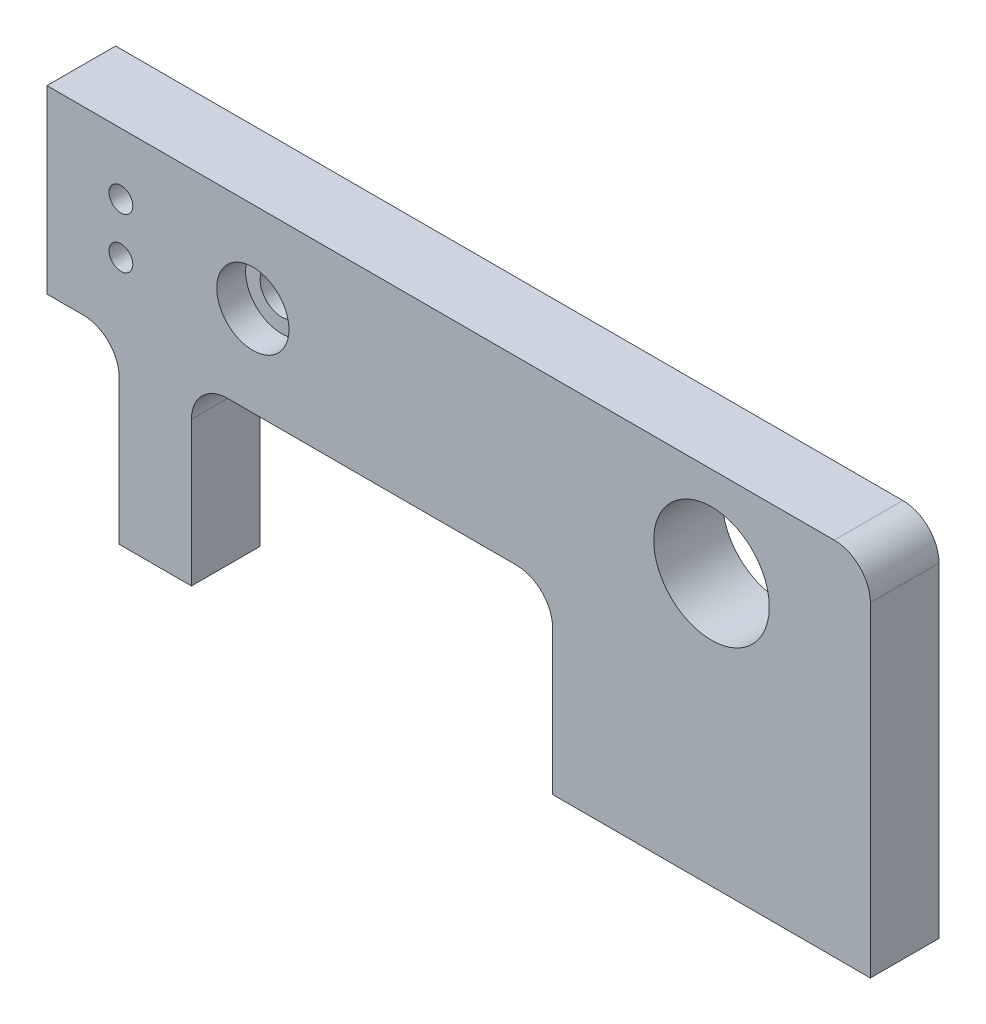
ISO-10303-21;
HEADER;
FILE_DESCRIPTION(('STEP AP214'),'2;1');
FILE_NAME('part.step','',(''),(''),'','','');
FILE_SCHEMA(('AUTOMOTIVE_DESIGN { 1 0 10303 214 1 1 1 1 }'));
ENDSEC;
DATA;
#1=APPLICATION_CONTEXT('core data for automotive mechanical design processes');
#2=APPLICATION_PROTOCOL_DEFINITION('international standard','automotive_design',2000,#1);
#3=PRODUCT_CONTEXT('',#1,'mechanical');
#4=PRODUCT('Part','Part','',(#3));
#5=PRODUCT_RELATED_PRODUCT_CATEGORY('part','',(#4));
#6=PRODUCT_DEFINITION_FORMATION('','',#4);
#7=PRODUCT_DEFINITION_CONTEXT('part definition',#1,'design');
#8=PRODUCT_DEFINITION('design','',#6,#7);
#9=PRODUCT_DEFINITION_SHAPE('','',#8);
#10=(LENGTH_UNIT() NAMED_UNIT(*) SI_UNIT(.MILLI.,.METRE.));
#11=(NAMED_UNIT(*) PLANE_ANGLE_UNIT() SI_UNIT($,.RADIAN.));
#12=(NAMED_UNIT(*) SI_UNIT($,.STERADIAN.) SOLID_ANGLE_UNIT());
#13=UNCERTAINTY_MEASURE_WITH_UNIT(LENGTH_MEASURE(1.E-05),#10,'distance_accuracy_value','');
#14=(GEOMETRIC_REPRESENTATION_CONTEXT(3) GLOBAL_UNCERTAINTY_ASSIGNED_CONTEXT((#13)) GLOBAL_UNIT_ASSIGNED_CONTEXT((#10,
#11,#12)) REPRESENTATION_CONTEXT('',''));
#15=CARTESIAN_POINT('',(0.,0.,0.));
#16=DIRECTION('',(0.,0.,1.));
#17=DIRECTION('',(1.,0.,0.));
#18=AXIS2_PLACEMENT_3D('',#15,#16,#17);
#19=CARTESIAN_POINT('',(-57.,-25.,4.75));
#20=DIRECTION('',(1.,0.,0.));
#21=DIRECTION('',(0.,0.,-1.));
#22=AXIS2_PLACEMENT_3D('',#19,#20,#21);
#23=PLANE('',#22);
#24=DIRECTION('',(0.,0.,1.));
#25=VECTOR('',#24,1.);
#26=CARTESIAN_POINT('',(-57.,0.,-4.75));
#27=LINE('',#26,#25);
#28=CARTESIAN_POINT('',(-57.,0.,-4.75));
#29=VERTEX_POINT('',#28);
#30=CARTESIAN_POINT('',(-57.,0.,4.75));
#31=VERTEX_POINT('',#30);
#32=EDGE_CURVE('E230',#29,#31,#27,.T.);
#33=ORIENTED_EDGE('',*,*,#32,.T.);
#34=DIRECTION('',(0.,-1.,0.));
#35=VECTOR('',#34,1.);
#36=CARTESIAN_POINT('',(-57.,-25.,4.75));
#37=LINE('',#36,#35);
#38=CARTESIAN_POINT('',(-57.,25.,4.75));
#39=VERTEX_POINT('',#38);
#40=EDGE_CURVE('E283',#39,#31,#37,.T.);
#41=ORIENTED_EDGE('',*,*,#40,.F.);
#42=DIRECTION('',(0.,0.,-1.));
#43=VECTOR('',#42,1.);
#44=CARTESIAN_POINT('',(-57.,25.,4.75));
#45=LINE('',#44,#43);
#46=CARTESIAN_POINT('',(-57.,25.,-4.75));
#47=VERTEX_POINT('',#46);
#48=EDGE_CURVE('E300',#39,#47,#45,.T.);
#49=ORIENTED_EDGE('',*,*,#48,.T.);
#50=DIRECTION('',(0.,-1.,0.));
#51=VECTOR('',#50,1.);
#52=CARTESIAN_POINT('',(-57.,-25.,-4.75));
#53=LINE('',#52,#51);
#54=EDGE_CURVE('E292',#47,#29,#53,.T.);
#55=ORIENTED_EDGE('',*,*,#54,.T.);
#56=EDGE_LOOP('',(#33,#41,#49,#55));
#57=FACE_BOUND('',#56,.T.);
#58=ADVANCED_FACE('F47',(#57),#23,.F.);
#59=CARTESIAN_POINT('',(-57.,-25.,4.75));
#60=DIRECTION('',(0.,1.,0.));
#61=DIRECTION('',(0.,0.,1.));
#62=AXIS2_PLACEMENT_3D('',#59,#60,#61);
#63=PLANE('',#62);
#64=CARTESIAN_POINT('',(-42.,-25.,0.));
#65=DIRECTION('',(0.,-1.,0.));
#66=DIRECTION('',(0.,0.,-1.));
#67=AXIS2_PLACEMENT_3D('',#64,#65,#66);
#68=CIRCLE('',#67,1.64999999999999);
#69=CARTESIAN_POINT('',(-42.,-25.,-1.64999999999999));
#70=VERTEX_POINT('',#69);
#71=EDGE_CURVE('E166',#70,#70,#68,.T.);
#72=ORIENTED_EDGE('',*,*,#71,.F.);
#73=EDGE_LOOP('',(#72));
#74=FACE_BOUND('',#73,.T.);
#75=DIRECTION('',(1.,0.,0.));
#76=VECTOR('',#75,1.);
#77=CARTESIAN_POINT('',(-57.,-25.,4.75));
#78=LINE('',#77,#76);
#79=CARTESIAN_POINT('',(-47.,-25.,4.75));
#80=VERTEX_POINT('',#79);
#81=CARTESIAN_POINT('',(-37.,-25.,4.75));
#82=VERTEX_POINT('',#81);
#83=EDGE_CURVE('E288',#80,#82,#78,.T.);
#84=ORIENTED_EDGE('',*,*,#83,.F.);
#85=DIRECTION('',(0.,0.,1.));
#86=VECTOR('',#85,1.);
#87=CARTESIAN_POINT('',(-47.,-25.,-4.75));
#88=LINE('',#87,#86);
#89=CARTESIAN_POINT('',(-47.,-25.,-4.75));
#90=VERTEX_POINT('',#89);
#91=EDGE_CURVE('E228',#90,#80,#88,.T.);
#92=ORIENTED_EDGE('',*,*,#91,.F.);
#93=DIRECTION('',(1.,0.,0.));
#94=VECTOR('',#93,1.);
#95=CARTESIAN_POINT('',(-57.,-25.,-4.75));
#96=LINE('',#95,#94);
#97=CARTESIAN_POINT('',(-37.,-25.,-4.75));
#98=VERTEX_POINT('',#97);
#99=EDGE_CURVE('E281',#90,#98,#96,.T.);
#100=ORIENTED_EDGE('',*,*,#99,.T.);
#101=DIRECTION('',(0.,0.,1.));
#102=VECTOR('',#101,1.);
#103=CARTESIAN_POINT('',(-37.,-25.,-4.75));
#104=LINE('',#103,#102);
#105=EDGE_CURVE('E270',#98,#82,#104,.T.);
#106=ORIENTED_EDGE('',*,*,#105,.T.);
#107=EDGE_LOOP('',(#84,#92,#100,#106));
#108=FACE_BOUND('',#107,.T.);
#109=ADVANCED_FACE('F335',(#74,#108),#63,.F.);
#110=CARTESIAN_POINT('',(57.,-25.,4.75));
#111=DIRECTION('',(-1.,0.,0.));
#112=DIRECTION('',(0.,0.,1.));
#113=AXIS2_PLACEMENT_3D('',#110,#111,#112);
#114=PLANE('',#113);
#115=DIRECTION('',(0.,1.,0.));
#116=VECTOR('',#115,1.);
#117=CARTESIAN_POINT('',(57.,-25.,-4.75));
#118=LINE('',#117,#116);
#119=CARTESIAN_POINT('',(57.,-25.,-4.75));
#120=VERTEX_POINT('',#119);
#121=CARTESIAN_POINT('',(57.,20.,-4.75));
#122=VERTEX_POINT('',#121);
#123=EDGE_CURVE('E267',#120,#122,#118,.T.);
#124=ORIENTED_EDGE('',*,*,#123,.T.);
#125=DIRECTION('',(0.,0.,-1.));
#126=VECTOR('',#125,1.);
#127=CARTESIAN_POINT('',(57.,20.,4.75));
#128=LINE('',#127,#126);
#129=CARTESIAN_POINT('',(57.,20.,4.75));
#130=VERTEX_POINT('',#129);
#131=EDGE_CURVE('E55',#122,#130,#128,.F.);
#132=ORIENTED_EDGE('',*,*,#131,.T.);
#133=DIRECTION('',(0.,1.,0.));
#134=VECTOR('',#133,1.);
#135=CARTESIAN_POINT('',(57.,-25.,4.75));
#136=LINE('',#135,#134);
#137=CARTESIAN_POINT('',(57.,-25.,4.75));
#138=VERTEX_POINT('',#137);
#139=EDGE_CURVE('E278',#138,#130,#136,.T.);
#140=ORIENTED_EDGE('',*,*,#139,.F.);
#141=DIRECTION('',(0.,0.,-1.));
#142=VECTOR('',#141,1.);
#143=CARTESIAN_POINT('',(57.,-25.,4.75));
#144=LINE('',#143,#142);
#145=EDGE_CURVE('E297',#138,#120,#144,.T.);
#146=ORIENTED_EDGE('',*,*,#145,.T.);
#147=EDGE_LOOP('',(#124,#132,#140,#146));
#148=FACE_BOUND('',#147,.T.);
#149=ADVANCED_FACE('F340',(#148),#114,.F.);
#150=CARTESIAN_POINT('',(-57.,25.,4.75));
#151=DIRECTION('',(0.,-1.,0.));
#152=DIRECTION('',(0.,0.,-1.));
#153=AXIS2_PLACEMENT_3D('',#150,#151,#152);
#154=PLANE('',#153);
#155=DIRECTION('',(-1.,0.,0.));
#156=VECTOR('',#155,1.);
#157=CARTESIAN_POINT('',(-57.,25.,4.75));
#158=LINE('',#157,#156);
#159=CARTESIAN_POINT('',(52.,25.,4.75));
#160=VERTEX_POINT('',#159);
#161=EDGE_CURVE('E280',#160,#39,#158,.T.);
#162=ORIENTED_EDGE('',*,*,#161,.F.);
#163=DIRECTION('',(0.,0.,-1.));
#164=VECTOR('',#163,1.);
#165=CARTESIAN_POINT('',(52.,25.,4.75));
#166=LINE('',#165,#164);
#167=CARTESIAN_POINT('',(52.,25.,-4.75));
#168=VERTEX_POINT('',#167);
#169=EDGE_CURVE('E303',#160,#168,#166,.T.);
#170=ORIENTED_EDGE('',*,*,#169,.T.);
#171=DIRECTION('',(-1.,0.,0.));
#172=VECTOR('',#171,1.);
#173=CARTESIAN_POINT('',(-57.,25.,-4.75));
#174=LINE('',#173,#172);
#175=EDGE_CURVE('E290',#168,#47,#174,.T.);
#176=ORIENTED_EDGE('',*,*,#175,.T.);
#177=ORIENTED_EDGE('',*,*,#48,.F.);
#178=EDGE_LOOP('',(#162,#170,#176,#177));
#179=FACE_BOUND('',#178,.T.);
#180=ADVANCED_FACE('F309',(#179),#154,.F.);
#181=CARTESIAN_POINT('',(21.,-25.,0.));
#182=DIRECTION('',(0.,-1.,0.));
#183=DIRECTION('',(0.,0.,-1.));
#184=AXIS2_PLACEMENT_3D('',#181,#182,#183);
#185=CIRCLE('',#184,1.64999999999999);
#186=CARTESIAN_POINT('',(21.,-25.,-1.64999999999999));
#187=VERTEX_POINT('',#186);
#188=EDGE_CURVE('E165',#187,#187,#185,.T.);
#189=ORIENTED_EDGE('',*,*,#188,.F.);
#190=EDGE_LOOP('',(#189));
#191=FACE_BOUND('',#190,.T.);
#192=CARTESIAN_POINT('',(49.,-25.,0.));
#193=DIRECTION('',(0.,-1.,0.));
#194=DIRECTION('',(0.,0.,-1.));
#195=AXIS2_PLACEMENT_3D('',#192,#193,#194);
#196=CIRCLE('',#195,1.64999999999999);
#197=CARTESIAN_POINT('',(49.,-25.,-1.64999999999999));
#198=VERTEX_POINT('',#197);
#199=EDGE_CURVE('E176',#198,#198,#196,.T.);
#200=ORIENTED_EDGE('',*,*,#199,.F.);
#201=EDGE_LOOP('',(#200));
#202=FACE_BOUND('',#201,.T.);
#203=CARTESIAN_POINT('',(13.,-25.,4.75));
#204=VERTEX_POINT('',#203);
#205=EDGE_CURVE('E286',#204,#138,#78,.T.);
#206=ORIENTED_EDGE('',*,*,#205,.F.);
#207=DIRECTION('',(0.,0.,1.));
#208=VECTOR('',#207,1.);
#209=CARTESIAN_POINT('',(13.,-25.,-4.75));
#210=LINE('',#209,#208);
#211=CARTESIAN_POINT('',(13.,-25.,-4.75));
#212=VERTEX_POINT('',#211);
#213=EDGE_CURVE('E268',#212,#204,#210,.T.);
#214=ORIENTED_EDGE('',*,*,#213,.F.);
#215=EDGE_CURVE('E295',#212,#120,#96,.T.);
#216=ORIENTED_EDGE('',*,*,#215,.T.);
#217=ORIENTED_EDGE('',*,*,#145,.F.);
#218=EDGE_LOOP('',(#206,#214,#216,#217));
#219=FACE_BOUND('',#218,.T.);
#220=ADVANCED_FACE('F343',(#191,#202,#219),#63,.F.);
#221=CARTESIAN_POINT('',(0.,0.,4.75));
#222=DIRECTION('',(0.,0.,-1.));
#223=DIRECTION('',(-1.,0.,0.));
#224=AXIS2_PLACEMENT_3D('',#221,#222,#223);
#225=PLANE('',#224);
#226=CARTESIAN_POINT('',(-46.77,9.5,4.75));
#227=DIRECTION('',(0.,0.,1.));
#228=DIRECTION('',(1.,0.,0.));
#229=AXIS2_PLACEMENT_3D('',#226,#227,#228);
#230=CIRCLE('',#229,1.65);
#231=CARTESIAN_POINT('',(-45.12,9.5,4.75));
#232=VERTEX_POINT('',#231);
#233=EDGE_CURVE('E182',#232,#232,#230,.T.);
#234=ORIENTED_EDGE('',*,*,#233,.F.);
#235=EDGE_LOOP('',(#234));
#236=FACE_BOUND('',#235,.T.);
#237=CARTESIAN_POINT('',(-46.77,16.5,4.75));
#238=DIRECTION('',(0.,0.,1.));
#239=DIRECTION('',(1.,0.,0.));
#240=AXIS2_PLACEMENT_3D('',#237,#238,#239);
#241=CIRCLE('',#240,1.65);
#242=CARTESIAN_POINT('',(-45.12,16.5,4.75));
#243=VERTEX_POINT('',#242);
#244=EDGE_CURVE('E188',#243,#243,#241,.T.);
#245=ORIENTED_EDGE('',*,*,#244,.F.);
#246=EDGE_LOOP('',(#245));
#247=FACE_BOUND('',#246,.T.);
#248=CARTESIAN_POINT('',(-28.5,12.5,4.75));
#249=DIRECTION('',(0.,0.,1.));
#250=DIRECTION('',(1.,0.,0.));
#251=AXIS2_PLACEMENT_3D('',#248,#249,#250);
#252=CIRCLE('',#251,5.);
#253=CARTESIAN_POINT('',(-23.5,12.5,4.75));
#254=VERTEX_POINT('',#253);
#255=EDGE_CURVE('E198',#254,#254,#252,.T.);
#256=ORIENTED_EDGE('',*,*,#255,.F.);
#257=EDGE_LOOP('',(#256));
#258=FACE_BOUND('',#257,.T.);
#259=CARTESIAN_POINT('',(35.,12.5,4.75));
#260=DIRECTION('',(0.,0.,1.));
#261=DIRECTION('',(1.,0.,0.));
#262=AXIS2_PLACEMENT_3D('',#259,#260,#261);
#263=CIRCLE('',#262,8.);
#264=CARTESIAN_POINT('',(43.,12.5,4.75));
#265=VERTEX_POINT('',#264);
#266=EDGE_CURVE('E204',#265,#265,#263,.T.);
#267=ORIENTED_EDGE('',*,*,#266,.F.);
#268=EDGE_LOOP('',(#267));
#269=FACE_BOUND('',#268,.T.);
#270=ORIENTED_EDGE('',*,*,#139,.T.);
#271=CARTESIAN_POINT('',(52.,20.,4.75));
#272=DIRECTION('',(0.,0.,-1.));
#273=DIRECTION('',(-1.,0.,0.));
#274=AXIS2_PLACEMENT_3D('',#271,#272,#273);
#275=CIRCLE('',#274,5.);
#276=EDGE_CURVE('E11',#130,#160,#275,.F.);
#277=ORIENTED_EDGE('',*,*,#276,.T.);
#278=ORIENTED_EDGE('',*,*,#161,.T.);
#279=ORIENTED_EDGE('',*,*,#40,.T.);
#280=DIRECTION('',(1.,0.,0.));
#281=VECTOR('',#280,1.);
#282=CARTESIAN_POINT('',(0.,0.,4.75));
#283=LINE('',#282,#281);
#284=CARTESIAN_POINT('',(-52.,0.,4.75));
#285=VERTEX_POINT('',#284);
#286=EDGE_CURVE('E219',#31,#285,#283,.T.);
#287=ORIENTED_EDGE('',*,*,#286,.T.);
#288=CARTESIAN_POINT('',(-52.,-5.,4.75));
#289=DIRECTION('',(0.,0.,1.));
#290=DIRECTION('',(1.,0.,0.));
#291=AXIS2_PLACEMENT_3D('',#288,#289,#290);
#292=CIRCLE('',#291,5.);
#293=CARTESIAN_POINT('',(-47.,-5.00000000000004,4.75));
#294=VERTEX_POINT('',#293);
#295=EDGE_CURVE('E216',#285,#294,#292,.F.);
#296=ORIENTED_EDGE('',*,*,#295,.T.);
#297=DIRECTION('',(0.,1.,0.));
#298=VECTOR('',#297,1.);
#299=CARTESIAN_POINT('',(-47.,0.,4.75));
#300=LINE('',#299,#298);
#301=EDGE_CURVE('E210',#80,#294,#300,.T.);
#302=ORIENTED_EDGE('',*,*,#301,.F.);
#303=ORIENTED_EDGE('',*,*,#83,.T.);
#304=DIRECTION('',(0.,1.,0.));
#305=VECTOR('',#304,1.);
#306=CARTESIAN_POINT('',(-37.,0.,4.75));
#307=LINE('',#306,#305);
#308=CARTESIAN_POINT('',(-37.,-5.00000000000003,4.75));
#309=VERTEX_POINT('',#308);
#310=EDGE_CURVE('E260',#82,#309,#307,.T.);
#311=ORIENTED_EDGE('',*,*,#310,.T.);
#312=CARTESIAN_POINT('',(-32.,-5.,4.75));
#313=DIRECTION('',(0.,0.,1.));
#314=DIRECTION('',(1.,0.,0.));
#315=AXIS2_PLACEMENT_3D('',#312,#313,#314);
#316=CIRCLE('',#315,5.);
#317=CARTESIAN_POINT('',(-32.,0.,4.75));
#318=VERTEX_POINT('',#317);
#319=EDGE_CURVE('E257',#318,#309,#316,.T.);
#320=ORIENTED_EDGE('',*,*,#319,.F.);
#321=DIRECTION('',(1.,0.,0.));
#322=VECTOR('',#321,1.);
#323=CARTESIAN_POINT('',(0.,0.,4.75));
#324=LINE('',#323,#322);
#325=CARTESIAN_POINT('',(7.99999999999998,0.,4.75));
#326=VERTEX_POINT('',#325);
#327=EDGE_CURVE('E254',#318,#326,#324,.T.);
#328=ORIENTED_EDGE('',*,*,#327,.T.);
#329=CARTESIAN_POINT('',(8.00000000000001,-5.,4.75));
#330=DIRECTION('',(0.,0.,1.));
#331=DIRECTION('',(1.,0.,0.));
#332=AXIS2_PLACEMENT_3D('',#329,#330,#331);
#333=CIRCLE('',#332,5.);
#334=CARTESIAN_POINT('',(13.,-5.00000000000003,4.75));
#335=VERTEX_POINT('',#334);
#336=EDGE_CURVE('E227',#326,#335,#333,.F.);
#337=ORIENTED_EDGE('',*,*,#336,.T.);
#338=DIRECTION('',(0.,1.,0.));
#339=VECTOR('',#338,1.);
#340=CARTESIAN_POINT('',(13.,0.,4.75));
#341=LINE('',#340,#339);
#342=EDGE_CURVE('E241',#204,#335,#341,.T.);
#343=ORIENTED_EDGE('',*,*,#342,.F.);
#344=ORIENTED_EDGE('',*,*,#205,.T.);
#345=EDGE_LOOP('',(#270,#277,#278,#279,#287,#296,#302,#303,#311,#320,#328,#337,#343,#344));
#346=FACE_BOUND('',#345,.T.);
#347=ADVANCED_FACE('F320',(#236,#247,#258,#269,#346),#225,.F.);
#348=CARTESIAN_POINT('',(0.,0.,-4.75));
#349=DIRECTION('',(0.,0.,-1.));
#350=DIRECTION('',(-1.,0.,0.));
#351=AXIS2_PLACEMENT_3D('',#348,#349,#350);
#352=PLANE('',#351);
#353=CARTESIAN_POINT('',(-46.77,9.5,-4.75));
#354=DIRECTION('',(0.,0.,1.));
#355=DIRECTION('',(1.,0.,0.));
#356=AXIS2_PLACEMENT_3D('',#353,#354,#355);
#357=CIRCLE('',#356,1.65);
#358=CARTESIAN_POINT('',(-45.12,9.5,-4.75));
#359=VERTEX_POINT('',#358);
#360=EDGE_CURVE('E185',#359,#359,#357,.T.);
#361=ORIENTED_EDGE('',*,*,#360,.T.);
#362=EDGE_LOOP('',(#361));
#363=FACE_BOUND('',#362,.T.);
#364=CARTESIAN_POINT('',(-46.77,16.5,-4.75));
#365=DIRECTION('',(0.,0.,1.));
#366=DIRECTION('',(1.,0.,0.));
#367=AXIS2_PLACEMENT_3D('',#364,#365,#366);
#368=CIRCLE('',#367,1.65);
#369=CARTESIAN_POINT('',(-45.12,16.5,-4.75));
#370=VERTEX_POINT('',#369);
#371=EDGE_CURVE('E191',#370,#370,#368,.T.);
#372=ORIENTED_EDGE('',*,*,#371,.T.);
#373=EDGE_LOOP('',(#372));
#374=FACE_BOUND('',#373,.T.);
#375=CARTESIAN_POINT('',(-28.5,12.5,-4.75));
#376=DIRECTION('',(0.,0.,1.));
#377=DIRECTION('',(1.,0.,0.));
#378=AXIS2_PLACEMENT_3D('',#375,#376,#377);
#379=CIRCLE('',#378,3.);
#380=CARTESIAN_POINT('',(-25.5,12.5,-4.75));
#381=VERTEX_POINT('',#380);
#382=EDGE_CURVE('E195',#381,#381,#379,.T.);
#383=ORIENTED_EDGE('',*,*,#382,.T.);
#384=EDGE_LOOP('',(#383));
#385=FACE_BOUND('',#384,.T.);
#386=CARTESIAN_POINT('',(35.,12.5,-4.75));
#387=DIRECTION('',(0.,0.,1.));
#388=DIRECTION('',(1.,0.,0.));
#389=AXIS2_PLACEMENT_3D('',#386,#387,#388);
#390=CIRCLE('',#389,8.);
#391=CARTESIAN_POINT('',(43.,12.5,-4.75));
#392=VERTEX_POINT('',#391);
#393=EDGE_CURVE('E220',#392,#392,#390,.T.);
#394=ORIENTED_EDGE('',*,*,#393,.T.);
#395=EDGE_LOOP('',(#394));
#396=FACE_BOUND('',#395,.T.);
#397=ORIENTED_EDGE('',*,*,#175,.F.);
#398=CARTESIAN_POINT('',(52.,20.,-4.75));
#399=DIRECTION('',(0.,0.,-1.));
#400=DIRECTION('',(-1.,0.,0.));
#401=AXIS2_PLACEMENT_3D('',#398,#399,#400);
#402=CIRCLE('',#401,5.);
#403=EDGE_CURVE('E69',#168,#122,#402,.T.);
#404=ORIENTED_EDGE('',*,*,#403,.T.);
#405=ORIENTED_EDGE('',*,*,#123,.F.);
#406=ORIENTED_EDGE('',*,*,#215,.F.);
#407=DIRECTION('',(0.,1.,0.));
#408=VECTOR('',#407,1.);
#409=CARTESIAN_POINT('',(13.,0.,-4.75));
#410=LINE('',#409,#408);
#411=CARTESIAN_POINT('',(13.,-5.00000000000003,-4.75));
#412=VERTEX_POINT('',#411);
#413=EDGE_CURVE('E248',#212,#412,#410,.T.);
#414=ORIENTED_EDGE('',*,*,#413,.T.);
#415=CARTESIAN_POINT('',(8.00000000000001,-5.,-4.75));
#416=DIRECTION('',(0.,0.,1.));
#417=DIRECTION('',(1.,0.,0.));
#418=AXIS2_PLACEMENT_3D('',#415,#416,#417);
#419=CIRCLE('',#418,5.);
#420=CARTESIAN_POINT('',(7.99999999999998,0.,-4.75));
#421=VERTEX_POINT('',#420);
#422=EDGE_CURVE('E238',#421,#412,#419,.F.);
#423=ORIENTED_EDGE('',*,*,#422,.F.);
#424=DIRECTION('',(1.,0.,0.));
#425=VECTOR('',#424,1.);
#426=CARTESIAN_POINT('',(0.,0.,-4.75));
#427=LINE('',#426,#425);
#428=CARTESIAN_POINT('',(-32.,0.,-4.75));
#429=VERTEX_POINT('',#428);
#430=EDGE_CURVE('E240',#429,#421,#427,.T.);
#431=ORIENTED_EDGE('',*,*,#430,.F.);
#432=CARTESIAN_POINT('',(-32.,-5.,-4.75));
#433=DIRECTION('',(0.,0.,1.));
#434=DIRECTION('',(1.,0.,0.));
#435=AXIS2_PLACEMENT_3D('',#432,#433,#434);
#436=CIRCLE('',#435,5.);
#437=CARTESIAN_POINT('',(-37.,-5.00000000000003,-4.75));
#438=VERTEX_POINT('',#437);
#439=EDGE_CURVE('E243',#429,#438,#436,.T.);
#440=ORIENTED_EDGE('',*,*,#439,.T.);
#441=DIRECTION('',(0.,1.,0.));
#442=VECTOR('',#441,1.);
#443=CARTESIAN_POINT('',(-37.,0.,-4.75));
#444=LINE('',#443,#442);
#445=EDGE_CURVE('E246',#98,#438,#444,.T.);
#446=ORIENTED_EDGE('',*,*,#445,.F.);
#447=ORIENTED_EDGE('',*,*,#99,.F.);
#448=DIRECTION('',(0.,1.,0.));
#449=VECTOR('',#448,1.);
#450=CARTESIAN_POINT('',(-47.,0.,-4.75));
#451=LINE('',#450,#449);
#452=CARTESIAN_POINT('',(-47.,-5.00000000000004,-4.75));
#453=VERTEX_POINT('',#452);
#454=EDGE_CURVE('E212',#90,#453,#451,.T.);
#455=ORIENTED_EDGE('',*,*,#454,.T.);
#456=CARTESIAN_POINT('',(-52.,-5.,-4.75));
#457=DIRECTION('',(0.,0.,1.));
#458=DIRECTION('',(1.,0.,0.));
#459=AXIS2_PLACEMENT_3D('',#456,#457,#458);
#460=CIRCLE('',#459,5.);
#461=CARTESIAN_POINT('',(-52.,0.,-4.75));
#462=VERTEX_POINT('',#461);
#463=EDGE_CURVE('E207',#462,#453,#460,.F.);
#464=ORIENTED_EDGE('',*,*,#463,.F.);
#465=DIRECTION('',(1.,0.,0.));
#466=VECTOR('',#465,1.);
#467=CARTESIAN_POINT('',(0.,0.,-4.75));
#468=LINE('',#467,#466);
#469=EDGE_CURVE('E209',#29,#462,#468,.T.);
#470=ORIENTED_EDGE('',*,*,#469,.F.);
#471=ORIENTED_EDGE('',*,*,#54,.F.);
#472=EDGE_LOOP('',(#397,#404,#405,#406,#414,#423,#431,#440,#446,#447,#455,#464,#470,#471));
#473=FACE_BOUND('',#472,.T.);
#474=ADVANCED_FACE('F314',(#363,#374,#385,#396,#473),#352,.T.);
#475=CARTESIAN_POINT('',(8.00000000000001,-5.,-4.75));
#476=DIRECTION('',(0.,0.,1.));
#477=DIRECTION('',(1.,0.,0.));
#478=AXIS2_PLACEMENT_3D('',#475,#476,#477);
#479=CYLINDRICAL_SURFACE('',#478,5.);
#480=ORIENTED_EDGE('',*,*,#336,.F.);
#481=DIRECTION('',(0.,0.,1.));
#482=VECTOR('',#481,1.);
#483=CARTESIAN_POINT('',(7.99999999999998,0.,-4.75));
#484=LINE('',#483,#482);
#485=EDGE_CURVE('E251',#421,#326,#484,.T.);
#486=ORIENTED_EDGE('',*,*,#485,.F.);
#487=ORIENTED_EDGE('',*,*,#422,.T.);
#488=DIRECTION('',(0.,0.,1.));
#489=VECTOR('',#488,1.);
#490=CARTESIAN_POINT('',(13.,-5.00000000000003,-4.75));
#491=LINE('',#490,#489);
#492=EDGE_CURVE('E265',#412,#335,#491,.T.);
#493=ORIENTED_EDGE('',*,*,#492,.T.);
#494=EDGE_LOOP('',(#480,#486,#487,#493));
#495=FACE_BOUND('',#494,.T.);
#496=ADVANCED_FACE('F365',(#495),#479,.F.);
#497=CARTESIAN_POINT('',(13.,0.,-4.75));
#498=DIRECTION('',(1.,0.,0.));
#499=DIRECTION('',(0.,0.,-1.));
#500=AXIS2_PLACEMENT_3D('',#497,#498,#499);
#501=PLANE('',#500);
#502=ORIENTED_EDGE('',*,*,#342,.T.);
#503=ORIENTED_EDGE('',*,*,#492,.F.);
#504=ORIENTED_EDGE('',*,*,#413,.F.);
#505=ORIENTED_EDGE('',*,*,#213,.T.);
#506=EDGE_LOOP('',(#502,#503,#504,#505));
#507=FACE_BOUND('',#506,.T.);
#508=ADVANCED_FACE('F358',(#507),#501,.F.);
#509=CARTESIAN_POINT('',(-37.,0.,-4.75));
#510=DIRECTION('',(1.,0.,0.));
#511=DIRECTION('',(0.,0.,-1.));
#512=AXIS2_PLACEMENT_3D('',#509,#510,#511);
#513=PLANE('',#512);
#514=ORIENTED_EDGE('',*,*,#310,.F.);
#515=ORIENTED_EDGE('',*,*,#105,.F.);
#516=ORIENTED_EDGE('',*,*,#445,.T.);
#517=DIRECTION('',(0.,0.,1.));
#518=VECTOR('',#517,1.);
#519=CARTESIAN_POINT('',(-37.,-5.00000000000003,-4.75));
#520=LINE('',#519,#518);
#521=EDGE_CURVE('E273',#438,#309,#520,.T.);
#522=ORIENTED_EDGE('',*,*,#521,.T.);
#523=EDGE_LOOP('',(#514,#515,#516,#522));
#524=FACE_BOUND('',#523,.T.);
#525=ADVANCED_FACE('F375',(#524),#513,.T.);
#526=CARTESIAN_POINT('',(-32.,-5.,-4.75));
#527=DIRECTION('',(0.,0.,1.));
#528=DIRECTION('',(1.,0.,0.));
#529=AXIS2_PLACEMENT_3D('',#526,#527,#528);
#530=CYLINDRICAL_SURFACE('',#529,5.);
#531=ORIENTED_EDGE('',*,*,#319,.T.);
#532=ORIENTED_EDGE('',*,*,#521,.F.);
#533=ORIENTED_EDGE('',*,*,#439,.F.);
#534=DIRECTION('',(0.,0.,1.));
#535=VECTOR('',#534,1.);
#536=CARTESIAN_POINT('',(-32.,0.,-4.75));
#537=LINE('',#536,#535);
#538=EDGE_CURVE('E275',#429,#318,#537,.T.);
#539=ORIENTED_EDGE('',*,*,#538,.T.);
#540=EDGE_LOOP('',(#531,#532,#533,#539));
#541=FACE_BOUND('',#540,.T.);
#542=ADVANCED_FACE('F372',(#541),#530,.F.);
#543=CARTESIAN_POINT('',(0.,0.,-4.75));
#544=DIRECTION('',(0.,-1.,0.));
#545=DIRECTION('',(0.,0.,-1.));
#546=AXIS2_PLACEMENT_3D('',#543,#544,#545);
#547=PLANE('',#546);
#548=ORIENTED_EDGE('',*,*,#327,.F.);
#549=ORIENTED_EDGE('',*,*,#538,.F.);
#550=ORIENTED_EDGE('',*,*,#430,.T.);
#551=ORIENTED_EDGE('',*,*,#485,.T.);
#552=EDGE_LOOP('',(#548,#549,#550,#551));
#553=FACE_BOUND('',#552,.T.);
#554=ADVANCED_FACE('F370',(#553),#547,.T.);
#555=CARTESIAN_POINT('',(-52.,-5.,-4.75));
#556=DIRECTION('',(0.,0.,1.));
#557=DIRECTION('',(1.,0.,0.));
#558=AXIS2_PLACEMENT_3D('',#555,#556,#557);
#559=CYLINDRICAL_SURFACE('',#558,5.);
#560=ORIENTED_EDGE('',*,*,#295,.F.);
#561=DIRECTION('',(0.,0.,1.));
#562=VECTOR('',#561,1.);
#563=CARTESIAN_POINT('',(-52.,0.,-4.75));
#564=LINE('',#563,#562);
#565=EDGE_CURVE('E215',#462,#285,#564,.T.);
#566=ORIENTED_EDGE('',*,*,#565,.F.);
#567=ORIENTED_EDGE('',*,*,#463,.T.);
#568=DIRECTION('',(0.,0.,1.));
#569=VECTOR('',#568,1.);
#570=CARTESIAN_POINT('',(-47.,-5.00000000000004,-4.75));
#571=LINE('',#570,#569);
#572=EDGE_CURVE('E225',#453,#294,#571,.T.);
#573=ORIENTED_EDGE('',*,*,#572,.T.);
#574=EDGE_LOOP('',(#560,#566,#567,#573));
#575=FACE_BOUND('',#574,.T.);
#576=ADVANCED_FACE('F389',(#575),#559,.F.);
#577=CARTESIAN_POINT('',(-47.,0.,-4.75));
#578=DIRECTION('',(1.,0.,0.));
#579=DIRECTION('',(0.,0.,-1.));
#580=AXIS2_PLACEMENT_3D('',#577,#578,#579);
#581=PLANE('',#580);
#582=ORIENTED_EDGE('',*,*,#301,.T.);
#583=ORIENTED_EDGE('',*,*,#572,.F.);
#584=ORIENTED_EDGE('',*,*,#454,.F.);
#585=ORIENTED_EDGE('',*,*,#91,.T.);
#586=EDGE_LOOP('',(#582,#583,#584,#585));
#587=FACE_BOUND('',#586,.T.);
#588=ADVANCED_FACE('F384',(#587),#581,.F.);
#589=CARTESIAN_POINT('',(0.,0.,-4.75));
#590=DIRECTION('',(0.,-1.,0.));
#591=DIRECTION('',(0.,0.,-1.));
#592=AXIS2_PLACEMENT_3D('',#589,#590,#591);
#593=PLANE('',#592);
#594=ORIENTED_EDGE('',*,*,#286,.F.);
#595=ORIENTED_EDGE('',*,*,#32,.F.);
#596=ORIENTED_EDGE('',*,*,#469,.T.);
#597=ORIENTED_EDGE('',*,*,#565,.T.);
#598=EDGE_LOOP('',(#594,#595,#596,#597));
#599=FACE_BOUND('',#598,.T.);
#600=ADVANCED_FACE('F331',(#599),#593,.T.);
#601=CARTESIAN_POINT('',(35.,12.5,-4.75));
#602=DIRECTION('',(0.,0.,1.));
#603=DIRECTION('',(1.,0.,0.));
#604=AXIS2_PLACEMENT_3D('',#601,#602,#603);
#605=CYLINDRICAL_SURFACE('',#604,8.);
#606=ORIENTED_EDGE('',*,*,#393,.F.);
#607=EDGE_LOOP('',(#606));
#608=FACE_BOUND('',#607,.T.);
#609=ORIENTED_EDGE('',*,*,#266,.T.);
#610=EDGE_LOOP('',(#609));
#611=FACE_BOUND('',#610,.T.);
#612=ADVANCED_FACE('F323',(#608,#611),#605,.F.);
#613=CARTESIAN_POINT('',(52.,20.,4.75));
#614=DIRECTION('',(0.,0.,-1.));
#615=DIRECTION('',(-1.,0.,0.));
#616=AXIS2_PLACEMENT_3D('',#613,#614,#615);
#617=CYLINDRICAL_SURFACE('',#616,5.);
#618=ORIENTED_EDGE('',*,*,#276,.F.);
#619=ORIENTED_EDGE('',*,*,#131,.F.);
#620=ORIENTED_EDGE('',*,*,#403,.F.);
#621=ORIENTED_EDGE('',*,*,#169,.F.);
#622=EDGE_LOOP('',(#618,#619,#620,#621));
#623=FACE_BOUND('',#622,.T.);
#624=ADVANCED_FACE('F49',(#623),#617,.T.);
#625=CARTESIAN_POINT('',(-28.5,12.5,0.75));
#626=DIRECTION('',(0.,0.,1.));
#627=DIRECTION('',(1.,0.,0.));
#628=AXIS2_PLACEMENT_3D('',#625,#626,#627);
#629=CYLINDRICAL_SURFACE('',#628,5.);
#630=CARTESIAN_POINT('',(-28.5,12.5,0.75));
#631=DIRECTION('',(0.,0.,1.));
#632=DIRECTION('',(1.,0.,0.));
#633=AXIS2_PLACEMENT_3D('',#630,#631,#632);
#634=CIRCLE('',#633,5.);
#635=CARTESIAN_POINT('',(-23.5,12.5,0.75));
#636=VERTEX_POINT('',#635);
#637=EDGE_CURVE('E201',#636,#636,#634,.T.);
#638=ORIENTED_EDGE('',*,*,#637,.F.);
#639=EDGE_LOOP('',(#638));
#640=FACE_BOUND('',#639,.T.);
#641=ORIENTED_EDGE('',*,*,#255,.T.);
#642=EDGE_LOOP('',(#641));
#643=FACE_BOUND('',#642,.T.);
#644=ADVANCED_FACE('F322',(#640,#643),#629,.F.);
#645=CARTESIAN_POINT('',(-28.5,12.5,0.75));
#646=DIRECTION('',(0.,0.,1.));
#647=DIRECTION('',(1.,0.,0.));
#648=AXIS2_PLACEMENT_3D('',#645,#646,#647);
#649=PLANE('',#648);
#650=CARTESIAN_POINT('',(-28.5,12.5,0.75));
#651=DIRECTION('',(0.,0.,1.));
#652=DIRECTION('',(1.,0.,0.));
#653=AXIS2_PLACEMENT_3D('',#650,#651,#652);
#654=CIRCLE('',#653,3.);
#655=CARTESIAN_POINT('',(-25.5,12.5,0.75));
#656=VERTEX_POINT('',#655);
#657=EDGE_CURVE('E194',#656,#656,#654,.T.);
#658=ORIENTED_EDGE('',*,*,#657,.F.);
#659=EDGE_LOOP('',(#658));
#660=FACE_BOUND('',#659,.T.);
#661=ORIENTED_EDGE('',*,*,#637,.T.);
#662=EDGE_LOOP('',(#661));
#663=FACE_BOUND('',#662,.T.);
#664=ADVANCED_FACE('F328',(#660,#663),#649,.T.);
#665=CARTESIAN_POINT('',(-28.5,12.5,-4.75));
#666=DIRECTION('',(0.,0.,1.));
#667=DIRECTION('',(1.,0.,0.));
#668=AXIS2_PLACEMENT_3D('',#665,#666,#667);
#669=CYLINDRICAL_SURFACE('',#668,3.);
#670=ORIENTED_EDGE('',*,*,#382,.F.);
#671=EDGE_LOOP('',(#670));
#672=FACE_BOUND('',#671,.T.);
#673=ORIENTED_EDGE('',*,*,#657,.T.);
#674=EDGE_LOOP('',(#673));
#675=FACE_BOUND('',#674,.T.);
#676=ADVANCED_FACE('F427',(#672,#675),#669,.F.);
#677=CARTESIAN_POINT('',(-46.77,16.5,4.75));
#678=DIRECTION('',(0.,0.,1.));
#679=DIRECTION('',(1.,0.,0.));
#680=AXIS2_PLACEMENT_3D('',#677,#678,#679);
#681=CYLINDRICAL_SURFACE('',#680,1.65);
#682=ORIENTED_EDGE('',*,*,#371,.F.);
#683=EDGE_LOOP('',(#682));
#684=FACE_BOUND('',#683,.T.);
#685=ORIENTED_EDGE('',*,*,#244,.T.);
#686=EDGE_LOOP('',(#685));
#687=FACE_BOUND('',#686,.T.);
#688=ADVANCED_FACE('F430',(#684,#687),#681,.F.);
#689=CARTESIAN_POINT('',(-46.77,9.5,4.75));
#690=DIRECTION('',(0.,0.,1.));
#691=DIRECTION('',(1.,0.,0.));
#692=AXIS2_PLACEMENT_3D('',#689,#690,#691);
#693=CYLINDRICAL_SURFACE('',#692,1.65);
#694=ORIENTED_EDGE('',*,*,#360,.F.);
#695=EDGE_LOOP('',(#694));
#696=FACE_BOUND('',#695,.T.);
#697=ORIENTED_EDGE('',*,*,#233,.T.);
#698=EDGE_LOOP('',(#697));
#699=FACE_BOUND('',#698,.T.);
#700=ADVANCED_FACE('F446',(#696,#699),#693,.F.);
#701=CARTESIAN_POINT('',(49.,-10.9,0.));
#702=DIRECTION('',(0.,-1.,0.));
#703=DIRECTION('',(0.,0.,-1.));
#704=AXIS2_PLACEMENT_3D('',#701,#702,#703);
#705=CONICAL_SURFACE('',#704,1.65,1.02974425867665);
#706=CARTESIAN_POINT('',(49.,-9.90857997860453,0.));
#707=VERTEX_POINT('',#706);
#708=VERTEX_LOOP('',#707);
#709=FACE_BOUND('',#708,.T.);
#710=CARTESIAN_POINT('',(49.,-10.9,0.));
#711=DIRECTION('',(0.,-1.,0.));
#712=DIRECTION('',(0.,0.,-1.));
#713=AXIS2_PLACEMENT_3D('',#710,#711,#712);
#714=CIRCLE('',#713,1.65);
#715=CARTESIAN_POINT('',(49.,-10.9,-1.65));
#716=VERTEX_POINT('',#715);
#717=EDGE_CURVE('E179',#716,#716,#714,.T.);
#718=ORIENTED_EDGE('',*,*,#717,.T.);
#719=EDGE_LOOP('',(#718));
#720=FACE_BOUND('',#719,.T.);
#721=ADVANCED_FACE('F450',(#709,#720),#705,.F.);
#722=CARTESIAN_POINT('',(49.,-25.,0.));
#723=DIRECTION('',(0.,-1.,0.));
#724=DIRECTION('',(0.,0.,-1.));
#725=AXIS2_PLACEMENT_3D('',#722,#723,#724);
#726=CYLINDRICAL_SURFACE('',#725,1.65);
#727=ORIENTED_EDGE('',*,*,#717,.F.);
#728=EDGE_LOOP('',(#727));
#729=FACE_BOUND('',#728,.T.);
#730=ORIENTED_EDGE('',*,*,#199,.T.);
#731=EDGE_LOOP('',(#730));
#732=FACE_BOUND('',#731,.T.);
#733=ADVANCED_FACE('F454',(#729,#732),#726,.F.);
#734=CARTESIAN_POINT('',(21.,-10.9,0.));
#735=DIRECTION('',(0.,-1.,0.));
#736=DIRECTION('',(0.,0.,-1.));
#737=AXIS2_PLACEMENT_3D('',#734,#735,#736);
#738=CONICAL_SURFACE('',#737,1.65,1.02974425867665);
#739=CARTESIAN_POINT('',(21.,-9.90857997860453,0.));
#740=VERTEX_POINT('',#739);
#741=VERTEX_LOOP('',#740);
#742=FACE_BOUND('',#741,.T.);
#743=CARTESIAN_POINT('',(21.,-10.9,0.));
#744=DIRECTION('',(0.,-1.,0.));
#745=DIRECTION('',(0.,0.,-1.));
#746=AXIS2_PLACEMENT_3D('',#743,#744,#745);
#747=CIRCLE('',#746,1.65);
#748=CARTESIAN_POINT('',(21.,-10.9,-1.65));
#749=VERTEX_POINT('',#748);
#750=EDGE_CURVE('E169',#749,#749,#747,.T.);
#751=ORIENTED_EDGE('',*,*,#750,.T.);
#752=EDGE_LOOP('',(#751));
#753=FACE_BOUND('',#752,.T.);
#754=ADVANCED_FACE('F458',(#742,#753),#738,.F.);
#755=CARTESIAN_POINT('',(21.,-25.,0.));
#756=DIRECTION('',(0.,-1.,0.));
#757=DIRECTION('',(0.,0.,-1.));
#758=AXIS2_PLACEMENT_3D('',#755,#756,#757);
#759=CYLINDRICAL_SURFACE('',#758,1.65);
#760=ORIENTED_EDGE('',*,*,#750,.F.);
#761=EDGE_LOOP('',(#760));
#762=FACE_BOUND('',#761,.T.);
#763=ORIENTED_EDGE('',*,*,#188,.T.);
#764=EDGE_LOOP('',(#763));
#765=FACE_BOUND('',#764,.T.);
#766=ADVANCED_FACE('F159',(#762,#765),#759,.F.);
#767=CARTESIAN_POINT('',(-42.,-10.9,0.));
#768=DIRECTION('',(0.,-1.,0.));
#769=DIRECTION('',(0.,0.,-1.));
#770=AXIS2_PLACEMENT_3D('',#767,#768,#769);
#771=CONICAL_SURFACE('',#770,1.65,1.02974425867665);
#772=CARTESIAN_POINT('',(-42.,-9.90857997860453,0.));
#773=VERTEX_POINT('',#772);
#774=VERTEX_LOOP('',#773);
#775=FACE_BOUND('',#774,.T.);
#776=CARTESIAN_POINT('',(-42.,-10.9,0.));
#777=DIRECTION('',(0.,-1.,0.));
#778=DIRECTION('',(0.,0.,-1.));
#779=AXIS2_PLACEMENT_3D('',#776,#777,#778);
#780=CIRCLE('',#779,1.65);
#781=CARTESIAN_POINT('',(-42.,-10.9,-1.65));
#782=VERTEX_POINT('',#781);
#783=EDGE_CURVE('E163',#782,#782,#780,.T.);
#784=ORIENTED_EDGE('',*,*,#783,.T.);
#785=EDGE_LOOP('',(#784));
#786=FACE_BOUND('',#785,.T.);
#787=ADVANCED_FACE('F155',(#775,#786),#771,.F.);
#788=CARTESIAN_POINT('',(-42.,-25.,0.));
#789=DIRECTION('',(0.,-1.,0.));
#790=DIRECTION('',(0.,0.,-1.));
#791=AXIS2_PLACEMENT_3D('',#788,#789,#790);
#792=CYLINDRICAL_SURFACE('',#791,1.65);
#793=ORIENTED_EDGE('',*,*,#783,.F.);
#794=EDGE_LOOP('',(#793));
#795=FACE_BOUND('',#794,.T.);
#796=ORIENTED_EDGE('',*,*,#71,.T.);
#797=EDGE_LOOP('',(#796));
#798=FACE_BOUND('',#797,.T.);
#799=ADVANCED_FACE('F158',(#795,#798),#792,.F.);
#800=CLOSED_SHELL('',(#58,#109,#149,#180,#220,#347,#474,#496,#508,#525,#542,#554,#576,#588,#600,
#612,#624,#644,#664,#676,#688,#700,#721,#733,#754,#766,#787,#799));
#801=MANIFOLD_SOLID_BREP('B2',#800);
#802=ADVANCED_BREP_SHAPE_REPRESENTATION('',(#18,#801),#14);
#803=SHAPE_DEFINITION_REPRESENTATION(#9,#802);
ENDSEC;
END-ISO-10303-21;
